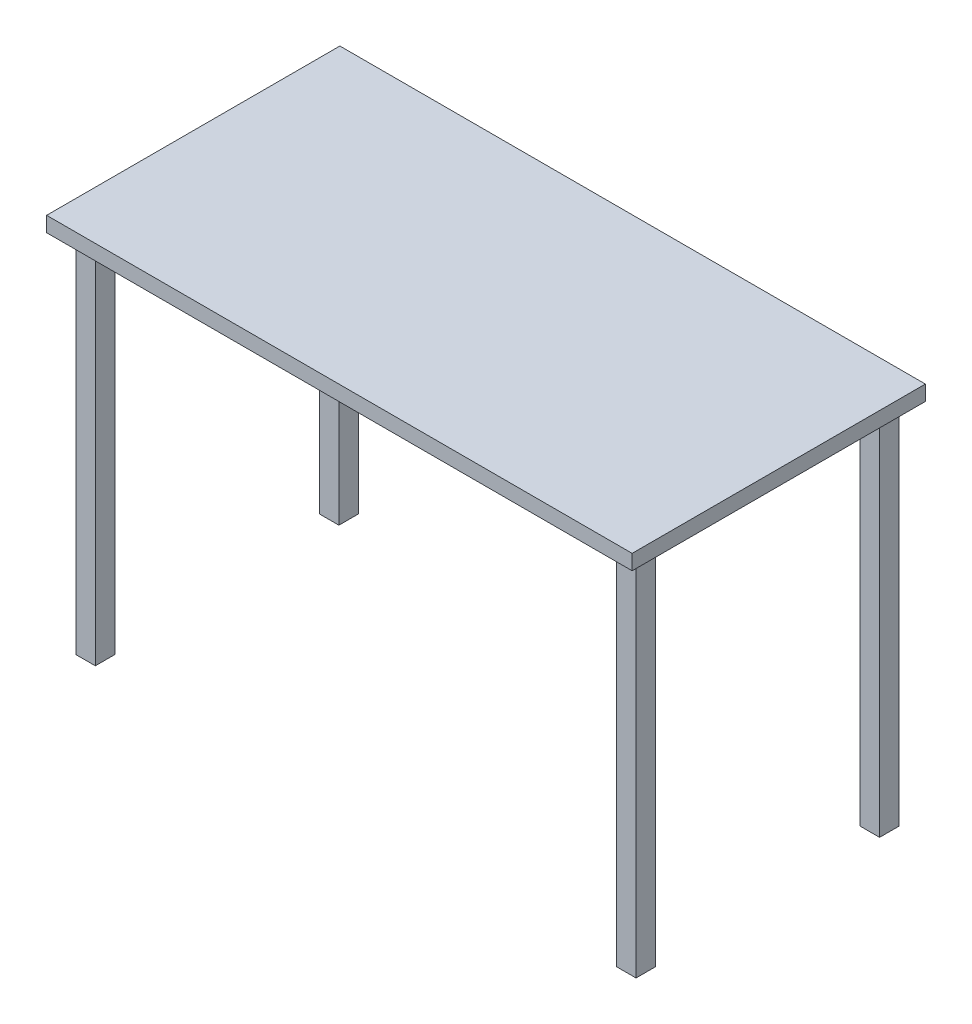
ISO-10303-21;
HEADER;
FILE_DESCRIPTION(('STEP AP214'),'2;1');
FILE_NAME('part.step','',(''),(''),'','','');
FILE_SCHEMA(('AUTOMOTIVE_DESIGN { 1 0 10303 214 1 1 1 1 }'));
ENDSEC;
DATA;
#1=APPLICATION_CONTEXT('core data for automotive mechanical design processes');
#2=APPLICATION_PROTOCOL_DEFINITION('international standard','automotive_design',2000,#1);
#3=PRODUCT_CONTEXT('',#1,'mechanical');
#4=PRODUCT('Part','Part','',(#3));
#5=PRODUCT_RELATED_PRODUCT_CATEGORY('part','',(#4));
#6=PRODUCT_DEFINITION_FORMATION('','',#4);
#7=PRODUCT_DEFINITION_CONTEXT('part definition',#1,'design');
#8=PRODUCT_DEFINITION('design','',#6,#7);
#9=PRODUCT_DEFINITION_SHAPE('','',#8);
#10=(LENGTH_UNIT() NAMED_UNIT(*) SI_UNIT(.MILLI.,.METRE.));
#11=(NAMED_UNIT(*) PLANE_ANGLE_UNIT() SI_UNIT($,.RADIAN.));
#12=(NAMED_UNIT(*) SI_UNIT($,.STERADIAN.) SOLID_ANGLE_UNIT());
#13=UNCERTAINTY_MEASURE_WITH_UNIT(LENGTH_MEASURE(1.E-05),#10,'distance_accuracy_value','');
#14=(GEOMETRIC_REPRESENTATION_CONTEXT(3) GLOBAL_UNCERTAINTY_ASSIGNED_CONTEXT((#13)) GLOBAL_UNIT_ASSIGNED_CONTEXT((#10,
#11,#12)) REPRESENTATION_CONTEXT('',''));
#15=CARTESIAN_POINT('',(0.,0.,0.));
#16=DIRECTION('',(0.,0.,1.));
#17=DIRECTION('',(1.,0.,0.));
#18=AXIS2_PLACEMENT_3D('',#15,#16,#17);
#19=CARTESIAN_POINT('',(0.,-31.,0.));
#20=DIRECTION('',(0.,-1.,0.));
#21=DIRECTION('',(1.,0.,0.));
#22=AXIS2_PLACEMENT_3D('',#19,#20,#21);
#23=PLANE('',#22);
#24=DIRECTION('',(0.,0.,1.));
#25=VECTOR('',#24,1.);
#26=CARTESIAN_POINT('',(601.,-31.,301.));
#27=LINE('',#26,#25);
#28=CARTESIAN_POINT('',(601.,-31.,-301.));
#29=VERTEX_POINT('',#28);
#30=CARTESIAN_POINT('',(601.,-31.,301.));
#31=VERTEX_POINT('',#30);
#32=EDGE_CURVE('E351',#29,#31,#27,.T.);
#33=ORIENTED_EDGE('',*,*,#32,.T.);
#34=DIRECTION('',(-1.,0.,0.));
#35=VECTOR('',#34,1.);
#36=CARTESIAN_POINT('',(-601.,-31.,301.));
#37=LINE('',#36,#35);
#38=CARTESIAN_POINT('',(-601.,-31.,301.));
#39=VERTEX_POINT('',#38);
#40=EDGE_CURVE('E355',#31,#39,#37,.T.);
#41=ORIENTED_EDGE('',*,*,#40,.T.);
#42=DIRECTION('',(0.,0.,-1.));
#43=VECTOR('',#42,1.);
#44=CARTESIAN_POINT('',(-601.,-31.,301.));
#45=LINE('',#44,#43);
#46=CARTESIAN_POINT('',(-601.,-31.,-301.));
#47=VERTEX_POINT('',#46);
#48=EDGE_CURVE('E359',#39,#47,#45,.T.);
#49=ORIENTED_EDGE('',*,*,#48,.T.);
#50=DIRECTION('',(1.,0.,0.));
#51=VECTOR('',#50,1.);
#52=CARTESIAN_POINT('',(-601.,-31.,-301.));
#53=LINE('',#52,#51);
#54=EDGE_CURVE('E362',#47,#29,#53,.T.);
#55=ORIENTED_EDGE('',*,*,#54,.T.);
#56=EDGE_LOOP('',(#33,#41,#49,#55));
#57=FACE_BOUND('',#56,.T.);
#58=DIRECTION('',(1.,0.,0.));
#59=VECTOR('',#58,1.);
#60=CARTESIAN_POINT('',(-571.,-31.,231.));
#61=LINE('',#60,#59);
#62=CARTESIAN_POINT('',(-571.,-31.,231.));
#63=VERTEX_POINT('',#62);
#64=CARTESIAN_POINT('',(-531.,-31.,231.));
#65=VERTEX_POINT('',#64);
#66=EDGE_CURVE('E328',#63,#65,#61,.T.);
#67=ORIENTED_EDGE('',*,*,#66,.F.);
#68=DIRECTION('',(0.,0.,-1.));
#69=VECTOR('',#68,1.);
#70=CARTESIAN_POINT('',(-571.,-31.,271.));
#71=LINE('',#70,#69);
#72=CARTESIAN_POINT('',(-571.,-31.,271.));
#73=VERTEX_POINT('',#72);
#74=EDGE_CURVE('E298',#73,#63,#71,.T.);
#75=ORIENTED_EDGE('',*,*,#74,.F.);
#76=DIRECTION('',(-1.,0.,0.));
#77=VECTOR('',#76,1.);
#78=CARTESIAN_POINT('',(-571.,-31.,271.));
#79=LINE('',#78,#77);
#80=CARTESIAN_POINT('',(-531.,-31.,271.));
#81=VERTEX_POINT('',#80);
#82=EDGE_CURVE('E315',#81,#73,#79,.T.);
#83=ORIENTED_EDGE('',*,*,#82,.F.);
#84=DIRECTION('',(0.,0.,1.));
#85=VECTOR('',#84,1.);
#86=CARTESIAN_POINT('',(-531.,-31.,271.));
#87=LINE('',#86,#85);
#88=EDGE_CURVE('E331',#65,#81,#87,.T.);
#89=ORIENTED_EDGE('',*,*,#88,.F.);
#90=EDGE_LOOP('',(#67,#75,#83,#89));
#91=FACE_BOUND('',#90,.T.);
#92=DIRECTION('',(0.,0.,-1.));
#93=VECTOR('',#92,1.);
#94=CARTESIAN_POINT('',(539.,-31.,271.));
#95=LINE('',#94,#93);
#96=CARTESIAN_POINT('',(539.,-31.,271.));
#97=VERTEX_POINT('',#96);
#98=CARTESIAN_POINT('',(539.,-31.,231.));
#99=VERTEX_POINT('',#98);
#100=EDGE_CURVE('E291',#97,#99,#95,.T.);
#101=ORIENTED_EDGE('',*,*,#100,.F.);
#102=DIRECTION('',(-1.,0.,0.));
#103=VECTOR('',#102,1.);
#104=CARTESIAN_POINT('',(539.,-31.,271.));
#105=LINE('',#104,#103);
#106=CARTESIAN_POINT('',(579.,-31.,271.));
#107=VERTEX_POINT('',#106);
#108=EDGE_CURVE('E294',#107,#97,#105,.T.);
#109=ORIENTED_EDGE('',*,*,#108,.F.);
#110=DIRECTION('',(0.,0.,1.));
#111=VECTOR('',#110,1.);
#112=CARTESIAN_POINT('',(579.,-31.,271.));
#113=LINE('',#112,#111);
#114=CARTESIAN_POINT('',(579.,-31.,231.));
#115=VERTEX_POINT('',#114);
#116=EDGE_CURVE('E283',#115,#107,#113,.T.);
#117=ORIENTED_EDGE('',*,*,#116,.F.);
#118=DIRECTION('',(1.,0.,0.));
#119=VECTOR('',#118,1.);
#120=CARTESIAN_POINT('',(539.,-31.,231.));
#121=LINE('',#120,#119);
#122=EDGE_CURVE('E286',#99,#115,#121,.T.);
#123=ORIENTED_EDGE('',*,*,#122,.F.);
#124=EDGE_LOOP('',(#101,#109,#117,#123));
#125=FACE_BOUND('',#124,.T.);
#126=DIRECTION('',(0.,0.,-1.));
#127=VECTOR('',#126,1.);
#128=CARTESIAN_POINT('',(539.000000000005,-31.,-229.));
#129=LINE('',#128,#127);
#130=CARTESIAN_POINT('',(539.000000000005,-31.,-229.));
#131=VERTEX_POINT('',#130);
#132=CARTESIAN_POINT('',(539.000000000005,-31.,-269.));
#133=VERTEX_POINT('',#132);
#134=EDGE_CURVE('E250',#131,#133,#129,.T.);
#135=ORIENTED_EDGE('',*,*,#134,.F.);
#136=DIRECTION('',(-1.,0.,0.));
#137=VECTOR('',#136,1.);
#138=CARTESIAN_POINT('',(539.000000000005,-31.,-229.));
#139=LINE('',#138,#137);
#140=CARTESIAN_POINT('',(579.000000000005,-31.,-229.));
#141=VERTEX_POINT('',#140);
#142=EDGE_CURVE('E253',#141,#131,#139,.T.);
#143=ORIENTED_EDGE('',*,*,#142,.F.);
#144=DIRECTION('',(0.,0.,1.));
#145=VECTOR('',#144,1.);
#146=CARTESIAN_POINT('',(579.000000000005,-31.,-229.));
#147=LINE('',#146,#145);
#148=CARTESIAN_POINT('',(579.000000000005,-31.,-269.));
#149=VERTEX_POINT('',#148);
#150=EDGE_CURVE('E243',#149,#141,#147,.T.);
#151=ORIENTED_EDGE('',*,*,#150,.F.);
#152=DIRECTION('',(1.,0.,0.));
#153=VECTOR('',#152,1.);
#154=CARTESIAN_POINT('',(539.000000000005,-31.,-269.));
#155=LINE('',#154,#153);
#156=EDGE_CURVE('E246',#133,#149,#155,.T.);
#157=ORIENTED_EDGE('',*,*,#156,.F.);
#158=EDGE_LOOP('',(#135,#143,#151,#157));
#159=FACE_BOUND('',#158,.T.);
#160=DIRECTION('',(0.,0.,-1.));
#161=VECTOR('',#160,1.);
#162=CARTESIAN_POINT('',(-570.999999999995,-31.,-229.));
#163=LINE('',#162,#161);
#164=CARTESIAN_POINT('',(-570.999999999995,-31.,-229.));
#165=VERTEX_POINT('',#164);
#166=CARTESIAN_POINT('',(-570.999999999995,-31.,-269.));
#167=VERTEX_POINT('',#166);
#168=EDGE_CURVE('E212',#165,#167,#163,.T.);
#169=ORIENTED_EDGE('',*,*,#168,.F.);
#170=DIRECTION('',(-1.,0.,0.));
#171=VECTOR('',#170,1.);
#172=CARTESIAN_POINT('',(-570.999999999995,-31.,-229.));
#173=LINE('',#172,#171);
#174=CARTESIAN_POINT('',(-530.999999999995,-31.,-229.));
#175=VERTEX_POINT('',#174);
#176=EDGE_CURVE('E206',#175,#165,#173,.T.);
#177=ORIENTED_EDGE('',*,*,#176,.F.);
#178=DIRECTION('',(0.,0.,1.));
#179=VECTOR('',#178,1.);
#180=CARTESIAN_POINT('',(-530.999999999995,-31.,-229.));
#181=LINE('',#180,#179);
#182=CARTESIAN_POINT('',(-530.999999999995,-31.,-269.));
#183=VERTEX_POINT('',#182);
#184=EDGE_CURVE('E190',#183,#175,#181,.T.);
#185=ORIENTED_EDGE('',*,*,#184,.F.);
#186=DIRECTION('',(1.,0.,0.));
#187=VECTOR('',#186,1.);
#188=CARTESIAN_POINT('',(-570.999999999995,-31.,-269.));
#189=LINE('',#188,#187);
#190=EDGE_CURVE('E199',#167,#183,#189,.T.);
#191=ORIENTED_EDGE('',*,*,#190,.F.);
#192=EDGE_LOOP('',(#169,#177,#185,#191));
#193=FACE_BOUND('',#192,.T.);
#194=ADVANCED_FACE('F51',(#57,#91,#125,#159,#193),#23,.T.);
#195=CARTESIAN_POINT('',(601.,-31.,301.));
#196=DIRECTION('',(-1.,0.,0.));
#197=DIRECTION('',(0.,0.,1.));
#198=AXIS2_PLACEMENT_3D('',#195,#196,#197);
#199=PLANE('',#198);
#200=DIRECTION('',(0.,0.,1.));
#201=VECTOR('',#200,1.);
#202=CARTESIAN_POINT('',(601.,0.,301.));
#203=LINE('',#202,#201);
#204=CARTESIAN_POINT('',(601.,0.,-301.));
#205=VERTEX_POINT('',#204);
#206=CARTESIAN_POINT('',(601.,0.,301.));
#207=VERTEX_POINT('',#206);
#208=EDGE_CURVE('E350',#205,#207,#203,.T.);
#209=ORIENTED_EDGE('',*,*,#208,.T.);
#210=DIRECTION('',(0.,1.,0.));
#211=VECTOR('',#210,1.);
#212=CARTESIAN_POINT('',(601.,-31.,301.));
#213=LINE('',#212,#211);
#214=EDGE_CURVE('E11',#31,#207,#213,.T.);
#215=ORIENTED_EDGE('',*,*,#214,.F.);
#216=ORIENTED_EDGE('',*,*,#32,.F.);
#217=DIRECTION('',(0.,1.,0.));
#218=VECTOR('',#217,1.);
#219=CARTESIAN_POINT('',(601.,-31.,-301.));
#220=LINE('',#219,#218);
#221=EDGE_CURVE('E365',#29,#205,#220,.T.);
#222=ORIENTED_EDGE('',*,*,#221,.T.);
#223=EDGE_LOOP('',(#209,#215,#216,#222));
#224=FACE_BOUND('',#223,.T.);
#225=ADVANCED_FACE('F53',(#224),#199,.F.);
#226=CARTESIAN_POINT('',(-601.,-31.,301.));
#227=DIRECTION('',(0.,0.,-1.));
#228=DIRECTION('',(-1.,0.,0.));
#229=AXIS2_PLACEMENT_3D('',#226,#227,#228);
#230=PLANE('',#229);
#231=DIRECTION('',(-1.,0.,0.));
#232=VECTOR('',#231,1.);
#233=CARTESIAN_POINT('',(-601.,0.,301.));
#234=LINE('',#233,#232);
#235=CARTESIAN_POINT('',(-601.,0.,301.));
#236=VERTEX_POINT('',#235);
#237=EDGE_CURVE('E369',#207,#236,#234,.T.);
#238=ORIENTED_EDGE('',*,*,#237,.T.);
#239=DIRECTION('',(0.,1.,0.));
#240=VECTOR('',#239,1.);
#241=CARTESIAN_POINT('',(-601.,-31.,301.));
#242=LINE('',#241,#240);
#243=EDGE_CURVE('E60',#39,#236,#242,.T.);
#244=ORIENTED_EDGE('',*,*,#243,.F.);
#245=ORIENTED_EDGE('',*,*,#40,.F.);
#246=ORIENTED_EDGE('',*,*,#214,.T.);
#247=EDGE_LOOP('',(#238,#244,#245,#246));
#248=FACE_BOUND('',#247,.T.);
#249=ADVANCED_FACE('F405',(#248),#230,.F.);
#250=CARTESIAN_POINT('',(-601.,-31.,301.));
#251=DIRECTION('',(1.,0.,0.));
#252=DIRECTION('',(0.,1.,0.));
#253=AXIS2_PLACEMENT_3D('',#250,#251,#252);
#254=PLANE('',#253);
#255=DIRECTION('',(0.,0.,-1.));
#256=VECTOR('',#255,1.);
#257=CARTESIAN_POINT('',(-601.,0.,301.));
#258=LINE('',#257,#256);
#259=CARTESIAN_POINT('',(-601.,0.,-301.));
#260=VERTEX_POINT('',#259);
#261=EDGE_CURVE('E372',#236,#260,#258,.T.);
#262=ORIENTED_EDGE('',*,*,#261,.T.);
#263=DIRECTION('',(0.,1.,0.));
#264=VECTOR('',#263,1.);
#265=CARTESIAN_POINT('',(-601.,-31.,-301.));
#266=LINE('',#265,#264);
#267=EDGE_CURVE('E380',#47,#260,#266,.T.);
#268=ORIENTED_EDGE('',*,*,#267,.F.);
#269=ORIENTED_EDGE('',*,*,#48,.F.);
#270=ORIENTED_EDGE('',*,*,#243,.T.);
#271=EDGE_LOOP('',(#262,#268,#269,#270));
#272=FACE_BOUND('',#271,.T.);
#273=ADVANCED_FACE('F389',(#272),#254,.F.);
#274=CARTESIAN_POINT('',(-601.,-31.,-301.));
#275=DIRECTION('',(0.,0.,1.));
#276=DIRECTION('',(1.,0.,0.));
#277=AXIS2_PLACEMENT_3D('',#274,#275,#276);
#278=PLANE('',#277);
#279=DIRECTION('',(1.,0.,0.));
#280=VECTOR('',#279,1.);
#281=CARTESIAN_POINT('',(-601.,0.,-301.));
#282=LINE('',#281,#280);
#283=EDGE_CURVE('E356',#260,#205,#282,.T.);
#284=ORIENTED_EDGE('',*,*,#283,.T.);
#285=ORIENTED_EDGE('',*,*,#221,.F.);
#286=ORIENTED_EDGE('',*,*,#54,.F.);
#287=ORIENTED_EDGE('',*,*,#267,.T.);
#288=EDGE_LOOP('',(#284,#285,#286,#287));
#289=FACE_BOUND('',#288,.T.);
#290=ADVANCED_FACE('F398',(#289),#278,.F.);
#291=CARTESIAN_POINT('',(0.,0.,0.));
#292=DIRECTION('',(0.,-1.,0.));
#293=DIRECTION('',(1.,0.,0.));
#294=AXIS2_PLACEMENT_3D('',#291,#292,#293);
#295=PLANE('',#294);
#296=ORIENTED_EDGE('',*,*,#261,.F.);
#297=ORIENTED_EDGE('',*,*,#237,.F.);
#298=ORIENTED_EDGE('',*,*,#208,.F.);
#299=ORIENTED_EDGE('',*,*,#283,.F.);
#300=EDGE_LOOP('',(#296,#297,#298,#299));
#301=FACE_BOUND('',#300,.T.);
#302=ADVANCED_FACE('F394',(#301),#295,.F.);
#303=CARTESIAN_POINT('',(-571.,-781.,271.));
#304=DIRECTION('',(1.,0.,0.));
#305=DIRECTION('',(0.,1.,0.));
#306=AXIS2_PLACEMENT_3D('',#303,#304,#305);
#307=PLANE('',#306);
#308=ORIENTED_EDGE('',*,*,#74,.T.);
#309=DIRECTION('',(0.,1.,0.));
#310=VECTOR('',#309,1.);
#311=CARTESIAN_POINT('',(-571.,-781.,231.));
#312=LINE('',#311,#310);
#313=CARTESIAN_POINT('',(-571.,-781.,231.));
#314=VERTEX_POINT('',#313);
#315=EDGE_CURVE('E347',#314,#63,#312,.T.);
#316=ORIENTED_EDGE('',*,*,#315,.F.);
#317=DIRECTION('',(0.,0.,-1.));
#318=VECTOR('',#317,1.);
#319=CARTESIAN_POINT('',(-571.,-781.,271.));
#320=LINE('',#319,#318);
#321=CARTESIAN_POINT('',(-571.,-781.,271.));
#322=VERTEX_POINT('',#321);
#323=EDGE_CURVE('E310',#322,#314,#320,.T.);
#324=ORIENTED_EDGE('',*,*,#323,.F.);
#325=DIRECTION('',(0.,1.,0.));
#326=VECTOR('',#325,1.);
#327=CARTESIAN_POINT('',(-571.,-781.,271.));
#328=LINE('',#327,#326);
#329=EDGE_CURVE('E324',#322,#73,#328,.T.);
#330=ORIENTED_EDGE('',*,*,#329,.T.);
#331=EDGE_LOOP('',(#308,#316,#324,#330));
#332=FACE_BOUND('',#331,.T.);
#333=ADVANCED_FACE('F421',(#332),#307,.F.);
#334=CARTESIAN_POINT('',(-571.,-781.,231.));
#335=DIRECTION('',(0.,0.,1.));
#336=DIRECTION('',(1.,0.,0.));
#337=AXIS2_PLACEMENT_3D('',#334,#335,#336);
#338=PLANE('',#337);
#339=ORIENTED_EDGE('',*,*,#66,.T.);
#340=DIRECTION('',(0.,1.,0.));
#341=VECTOR('',#340,1.);
#342=CARTESIAN_POINT('',(-531.,-781.,231.));
#343=LINE('',#342,#341);
#344=CARTESIAN_POINT('',(-531.,-781.,231.));
#345=VERTEX_POINT('',#344);
#346=EDGE_CURVE('E343',#345,#65,#343,.T.);
#347=ORIENTED_EDGE('',*,*,#346,.F.);
#348=DIRECTION('',(1.,0.,0.));
#349=VECTOR('',#348,1.);
#350=CARTESIAN_POINT('',(-571.,-781.,231.));
#351=LINE('',#350,#349);
#352=EDGE_CURVE('E314',#314,#345,#351,.T.);
#353=ORIENTED_EDGE('',*,*,#352,.F.);
#354=ORIENTED_EDGE('',*,*,#315,.T.);
#355=EDGE_LOOP('',(#339,#347,#353,#354));
#356=FACE_BOUND('',#355,.T.);
#357=ADVANCED_FACE('F616',(#356),#338,.F.);
#358=CARTESIAN_POINT('',(-531.,-781.,271.));
#359=DIRECTION('',(-1.,0.,0.));
#360=DIRECTION('',(0.,-1.,0.));
#361=AXIS2_PLACEMENT_3D('',#358,#359,#360);
#362=PLANE('',#361);
#363=ORIENTED_EDGE('',*,*,#88,.T.);
#364=DIRECTION('',(0.,1.,0.));
#365=VECTOR('',#364,1.);
#366=CARTESIAN_POINT('',(-531.,-781.,271.));
#367=LINE('',#366,#365);
#368=CARTESIAN_POINT('',(-531.,-781.,271.));
#369=VERTEX_POINT('',#368);
#370=EDGE_CURVE('E340',#369,#81,#367,.T.);
#371=ORIENTED_EDGE('',*,*,#370,.F.);
#372=DIRECTION('',(0.,0.,1.));
#373=VECTOR('',#372,1.);
#374=CARTESIAN_POINT('',(-531.,-781.,271.));
#375=LINE('',#374,#373);
#376=EDGE_CURVE('E318',#345,#369,#375,.T.);
#377=ORIENTED_EDGE('',*,*,#376,.F.);
#378=ORIENTED_EDGE('',*,*,#346,.T.);
#379=EDGE_LOOP('',(#363,#371,#377,#378));
#380=FACE_BOUND('',#379,.T.);
#381=ADVANCED_FACE('F606',(#380),#362,.F.);
#382=CARTESIAN_POINT('',(-571.,-781.,271.));
#383=DIRECTION('',(0.,0.,-1.));
#384=DIRECTION('',(0.,1.,0.));
#385=AXIS2_PLACEMENT_3D('',#382,#383,#384);
#386=PLANE('',#385);
#387=ORIENTED_EDGE('',*,*,#82,.T.);
#388=ORIENTED_EDGE('',*,*,#329,.F.);
#389=DIRECTION('',(-1.,0.,0.));
#390=VECTOR('',#389,1.);
#391=CARTESIAN_POINT('',(-571.,-781.,271.));
#392=LINE('',#391,#390);
#393=EDGE_CURVE('E321',#369,#322,#392,.T.);
#394=ORIENTED_EDGE('',*,*,#393,.F.);
#395=ORIENTED_EDGE('',*,*,#370,.T.);
#396=EDGE_LOOP('',(#387,#388,#394,#395));
#397=FACE_BOUND('',#396,.T.);
#398=ADVANCED_FACE('F596',(#397),#386,.F.);
#399=CARTESIAN_POINT('',(0.,-781.,0.));
#400=DIRECTION('',(0.,-1.,0.));
#401=DIRECTION('',(0.,0.,-1.));
#402=AXIS2_PLACEMENT_3D('',#399,#400,#401);
#403=PLANE('',#402);
#404=ORIENTED_EDGE('',*,*,#323,.T.);
#405=ORIENTED_EDGE('',*,*,#352,.T.);
#406=ORIENTED_EDGE('',*,*,#376,.T.);
#407=ORIENTED_EDGE('',*,*,#393,.T.);
#408=EDGE_LOOP('',(#404,#405,#406,#407));
#409=FACE_BOUND('',#408,.T.);
#410=ADVANCED_FACE('F586',(#409),#403,.T.);
#411=CARTESIAN_POINT('',(539.,-781.,271.));
#412=DIRECTION('',(0.,0.,-1.));
#413=DIRECTION('',(0.,1.,0.));
#414=AXIS2_PLACEMENT_3D('',#411,#412,#413);
#415=PLANE('',#414);
#416=ORIENTED_EDGE('',*,*,#108,.T.);
#417=DIRECTION('',(0.,1.,0.));
#418=VECTOR('',#417,1.);
#419=CARTESIAN_POINT('',(539.,-781.,271.));
#420=LINE('',#419,#418);
#421=CARTESIAN_POINT('',(539.,-781.,271.));
#422=VERTEX_POINT('',#421);
#423=EDGE_CURVE('E257',#422,#97,#420,.T.);
#424=ORIENTED_EDGE('',*,*,#423,.F.);
#425=DIRECTION('',(-1.,0.,0.));
#426=VECTOR('',#425,1.);
#427=CARTESIAN_POINT('',(539.,-781.,271.));
#428=LINE('',#427,#426);
#429=CARTESIAN_POINT('',(579.,-781.,271.));
#430=VERTEX_POINT('',#429);
#431=EDGE_CURVE('E287',#430,#422,#428,.T.);
#432=ORIENTED_EDGE('',*,*,#431,.F.);
#433=DIRECTION('',(0.,1.,0.));
#434=VECTOR('',#433,1.);
#435=CARTESIAN_POINT('',(579.,-781.,271.));
#436=LINE('',#435,#434);
#437=EDGE_CURVE('E278',#430,#107,#436,.T.);
#438=ORIENTED_EDGE('',*,*,#437,.T.);
#439=EDGE_LOOP('',(#416,#424,#432,#438));
#440=FACE_BOUND('',#439,.T.);
#441=ADVANCED_FACE('F576',(#440),#415,.F.);
#442=CARTESIAN_POINT('',(539.,-781.,271.));
#443=DIRECTION('',(1.,0.,0.));
#444=DIRECTION('',(0.,1.,0.));
#445=AXIS2_PLACEMENT_3D('',#442,#443,#444);
#446=PLANE('',#445);
#447=ORIENTED_EDGE('',*,*,#100,.T.);
#448=DIRECTION('',(0.,1.,0.));
#449=VECTOR('',#448,1.);
#450=CARTESIAN_POINT('',(539.,-781.,231.));
#451=LINE('',#450,#449);
#452=CARTESIAN_POINT('',(539.,-781.,231.));
#453=VERTEX_POINT('',#452);
#454=EDGE_CURVE('E271',#453,#99,#451,.T.);
#455=ORIENTED_EDGE('',*,*,#454,.F.);
#456=DIRECTION('',(0.,0.,-1.));
#457=VECTOR('',#456,1.);
#458=CARTESIAN_POINT('',(539.,-781.,271.));
#459=LINE('',#458,#457);
#460=EDGE_CURVE('E304',#422,#453,#459,.T.);
#461=ORIENTED_EDGE('',*,*,#460,.F.);
#462=ORIENTED_EDGE('',*,*,#423,.T.);
#463=EDGE_LOOP('',(#447,#455,#461,#462));
#464=FACE_BOUND('',#463,.T.);
#465=ADVANCED_FACE('F566',(#464),#446,.F.);
#466=CARTESIAN_POINT('',(539.,-781.,231.));
#467=DIRECTION('',(0.,0.,1.));
#468=DIRECTION('',(1.,0.,0.));
#469=AXIS2_PLACEMENT_3D('',#466,#467,#468);
#470=PLANE('',#469);
#471=ORIENTED_EDGE('',*,*,#122,.T.);
#472=DIRECTION('',(0.,1.,0.));
#473=VECTOR('',#472,1.);
#474=CARTESIAN_POINT('',(579.,-781.,231.));
#475=LINE('',#474,#473);
#476=CARTESIAN_POINT('',(579.,-781.,231.));
#477=VERTEX_POINT('',#476);
#478=EDGE_CURVE('E275',#477,#115,#475,.T.);
#479=ORIENTED_EDGE('',*,*,#478,.F.);
#480=DIRECTION('',(1.,0.,0.));
#481=VECTOR('',#480,1.);
#482=CARTESIAN_POINT('',(539.,-781.,231.));
#483=LINE('',#482,#481);
#484=EDGE_CURVE('E301',#453,#477,#483,.T.);
#485=ORIENTED_EDGE('',*,*,#484,.F.);
#486=ORIENTED_EDGE('',*,*,#454,.T.);
#487=EDGE_LOOP('',(#471,#479,#485,#486));
#488=FACE_BOUND('',#487,.T.);
#489=ADVANCED_FACE('F556',(#488),#470,.F.);
#490=CARTESIAN_POINT('',(579.,-781.,271.));
#491=DIRECTION('',(-1.,0.,0.));
#492=DIRECTION('',(0.,-1.,0.));
#493=AXIS2_PLACEMENT_3D('',#490,#491,#492);
#494=PLANE('',#493);
#495=ORIENTED_EDGE('',*,*,#116,.T.);
#496=ORIENTED_EDGE('',*,*,#437,.F.);
#497=DIRECTION('',(0.,0.,1.));
#498=VECTOR('',#497,1.);
#499=CARTESIAN_POINT('',(579.,-781.,271.));
#500=LINE('',#499,#498);
#501=EDGE_CURVE('E282',#477,#430,#500,.T.);
#502=ORIENTED_EDGE('',*,*,#501,.F.);
#503=ORIENTED_EDGE('',*,*,#478,.T.);
#504=EDGE_LOOP('',(#495,#496,#502,#503));
#505=FACE_BOUND('',#504,.T.);
#506=ADVANCED_FACE('F546',(#505),#494,.F.);
#507=CARTESIAN_POINT('',(0.,-781.,0.));
#508=DIRECTION('',(0.,1.,0.));
#509=DIRECTION('',(0.,0.,1.));
#510=AXIS2_PLACEMENT_3D('',#507,#508,#509);
#511=PLANE('',#510);
#512=ORIENTED_EDGE('',*,*,#431,.T.);
#513=ORIENTED_EDGE('',*,*,#460,.T.);
#514=ORIENTED_EDGE('',*,*,#484,.T.);
#515=ORIENTED_EDGE('',*,*,#501,.T.);
#516=EDGE_LOOP('',(#512,#513,#514,#515));
#517=FACE_BOUND('',#516,.T.);
#518=ADVANCED_FACE('F536',(#517),#511,.F.);
#519=CARTESIAN_POINT('',(539.000000000005,-781.,-229.));
#520=DIRECTION('',(0.,0.,-1.));
#521=DIRECTION('',(0.,1.,0.));
#522=AXIS2_PLACEMENT_3D('',#519,#520,#521);
#523=PLANE('',#522);
#524=ORIENTED_EDGE('',*,*,#142,.T.);
#525=DIRECTION('',(0.,1.,0.));
#526=VECTOR('',#525,1.);
#527=CARTESIAN_POINT('',(539.000000000005,-781.,-229.));
#528=LINE('',#527,#526);
#529=CARTESIAN_POINT('',(539.000000000005,-781.,-229.));
#530=VERTEX_POINT('',#529);
#531=EDGE_CURVE('E214',#530,#131,#528,.T.);
#532=ORIENTED_EDGE('',*,*,#531,.F.);
#533=DIRECTION('',(-1.,0.,0.));
#534=VECTOR('',#533,1.);
#535=CARTESIAN_POINT('',(539.000000000005,-781.,-229.));
#536=LINE('',#535,#534);
#537=CARTESIAN_POINT('',(579.000000000005,-781.,-229.));
#538=VERTEX_POINT('',#537);
#539=EDGE_CURVE('E247',#538,#530,#536,.T.);
#540=ORIENTED_EDGE('',*,*,#539,.F.);
#541=DIRECTION('',(0.,1.,0.));
#542=VECTOR('',#541,1.);
#543=CARTESIAN_POINT('',(579.000000000005,-781.,-229.));
#544=LINE('',#543,#542);
#545=EDGE_CURVE('E238',#538,#141,#544,.T.);
#546=ORIENTED_EDGE('',*,*,#545,.T.);
#547=EDGE_LOOP('',(#524,#532,#540,#546));
#548=FACE_BOUND('',#547,.T.);
#549=ADVANCED_FACE('F526',(#548),#523,.F.);
#550=CARTESIAN_POINT('',(539.000000000005,-781.,-229.));
#551=DIRECTION('',(1.,0.,0.));
#552=DIRECTION('',(0.,1.,0.));
#553=AXIS2_PLACEMENT_3D('',#550,#551,#552);
#554=PLANE('',#553);
#555=ORIENTED_EDGE('',*,*,#134,.T.);
#556=DIRECTION('',(0.,1.,0.));
#557=VECTOR('',#556,1.);
#558=CARTESIAN_POINT('',(539.000000000005,-781.,-269.));
#559=LINE('',#558,#557);
#560=CARTESIAN_POINT('',(539.000000000005,-781.,-269.));
#561=VERTEX_POINT('',#560);
#562=EDGE_CURVE('E218',#561,#133,#559,.T.);
#563=ORIENTED_EDGE('',*,*,#562,.F.);
#564=DIRECTION('',(0.,0.,-1.));
#565=VECTOR('',#564,1.);
#566=CARTESIAN_POINT('',(539.000000000005,-781.,-229.));
#567=LINE('',#566,#565);
#568=EDGE_CURVE('E263',#530,#561,#567,.T.);
#569=ORIENTED_EDGE('',*,*,#568,.F.);
#570=ORIENTED_EDGE('',*,*,#531,.T.);
#571=EDGE_LOOP('',(#555,#563,#569,#570));
#572=FACE_BOUND('',#571,.T.);
#573=ADVANCED_FACE('F516',(#572),#554,.F.);
#574=CARTESIAN_POINT('',(539.000000000005,-781.,-269.));
#575=DIRECTION('',(0.,0.,1.));
#576=DIRECTION('',(1.,0.,0.));
#577=AXIS2_PLACEMENT_3D('',#574,#575,#576);
#578=PLANE('',#577);
#579=ORIENTED_EDGE('',*,*,#156,.T.);
#580=DIRECTION('',(0.,1.,0.));
#581=VECTOR('',#580,1.);
#582=CARTESIAN_POINT('',(579.000000000005,-781.,-269.));
#583=LINE('',#582,#581);
#584=CARTESIAN_POINT('',(579.000000000005,-781.,-269.));
#585=VERTEX_POINT('',#584);
#586=EDGE_CURVE('E75',#585,#149,#583,.T.);
#587=ORIENTED_EDGE('',*,*,#586,.F.);
#588=DIRECTION('',(1.,0.,0.));
#589=VECTOR('',#588,1.);
#590=CARTESIAN_POINT('',(539.000000000005,-781.,-269.));
#591=LINE('',#590,#589);
#592=EDGE_CURVE('E260',#561,#585,#591,.T.);
#593=ORIENTED_EDGE('',*,*,#592,.F.);
#594=ORIENTED_EDGE('',*,*,#562,.T.);
#595=EDGE_LOOP('',(#579,#587,#593,#594));
#596=FACE_BOUND('',#595,.T.);
#597=ADVANCED_FACE('F507',(#596),#578,.F.);
#598=CARTESIAN_POINT('',(579.000000000005,-781.,-229.));
#599=DIRECTION('',(-1.,0.,0.));
#600=DIRECTION('',(0.,-1.,0.));
#601=AXIS2_PLACEMENT_3D('',#598,#599,#600);
#602=PLANE('',#601);
#603=ORIENTED_EDGE('',*,*,#150,.T.);
#604=ORIENTED_EDGE('',*,*,#545,.F.);
#605=DIRECTION('',(0.,0.,1.));
#606=VECTOR('',#605,1.);
#607=CARTESIAN_POINT('',(579.000000000005,-781.,-229.));
#608=LINE('',#607,#606);
#609=EDGE_CURVE('E242',#585,#538,#608,.T.);
#610=ORIENTED_EDGE('',*,*,#609,.F.);
#611=ORIENTED_EDGE('',*,*,#586,.T.);
#612=EDGE_LOOP('',(#603,#604,#610,#611));
#613=FACE_BOUND('',#612,.T.);
#614=ADVANCED_FACE('F497',(#613),#602,.F.);
#615=CARTESIAN_POINT('',(0.,-781.,0.));
#616=DIRECTION('',(0.,1.,0.));
#617=DIRECTION('',(0.,0.,1.));
#618=AXIS2_PLACEMENT_3D('',#615,#616,#617);
#619=PLANE('',#618);
#620=ORIENTED_EDGE('',*,*,#539,.T.);
#621=ORIENTED_EDGE('',*,*,#568,.T.);
#622=ORIENTED_EDGE('',*,*,#592,.T.);
#623=ORIENTED_EDGE('',*,*,#609,.T.);
#624=EDGE_LOOP('',(#620,#621,#622,#623));
#625=FACE_BOUND('',#624,.T.);
#626=ADVANCED_FACE('F488',(#625),#619,.F.);
#627=CARTESIAN_POINT('',(-570.999999999995,-781.,-229.));
#628=DIRECTION('',(0.,0.,-1.));
#629=DIRECTION('',(0.,1.,0.));
#630=AXIS2_PLACEMENT_3D('',#627,#628,#629);
#631=PLANE('',#630);
#632=ORIENTED_EDGE('',*,*,#176,.T.);
#633=DIRECTION('',(0.,1.,0.));
#634=VECTOR('',#633,1.);
#635=CARTESIAN_POINT('',(-570.999999999995,-781.,-229.));
#636=LINE('',#635,#634);
#637=CARTESIAN_POINT('',(-570.999999999995,-781.,-229.));
#638=VERTEX_POINT('',#637);
#639=EDGE_CURVE('E693',#638,#165,#636,.T.);
#640=ORIENTED_EDGE('',*,*,#639,.F.);
#641=DIRECTION('',(-1.,0.,0.));
#642=VECTOR('',#641,1.);
#643=CARTESIAN_POINT('',(-570.999999999995,-781.,-229.));
#644=LINE('',#643,#642);
#645=CARTESIAN_POINT('',(-530.999999999995,-781.,-229.));
#646=VERTEX_POINT('',#645);
#647=EDGE_CURVE('E200',#646,#638,#644,.T.);
#648=ORIENTED_EDGE('',*,*,#647,.F.);
#649=DIRECTION('',(0.,1.,0.));
#650=VECTOR('',#649,1.);
#651=CARTESIAN_POINT('',(-530.999999999995,-781.,-229.));
#652=LINE('',#651,#650);
#653=EDGE_CURVE('E193',#646,#175,#652,.T.);
#654=ORIENTED_EDGE('',*,*,#653,.T.);
#655=EDGE_LOOP('',(#632,#640,#648,#654));
#656=FACE_BOUND('',#655,.T.);
#657=ADVANCED_FACE('F204',(#656),#631,.F.);
#658=CARTESIAN_POINT('',(-570.999999999995,-781.,-229.));
#659=DIRECTION('',(1.,0.,0.));
#660=DIRECTION('',(0.,1.,0.));
#661=AXIS2_PLACEMENT_3D('',#658,#659,#660);
#662=PLANE('',#661);
#663=ORIENTED_EDGE('',*,*,#168,.T.);
#664=DIRECTION('',(0.,1.,0.));
#665=VECTOR('',#664,1.);
#666=CARTESIAN_POINT('',(-570.999999999995,-781.,-269.));
#667=LINE('',#666,#665);
#668=CARTESIAN_POINT('',(-570.999999999995,-781.,-269.));
#669=VERTEX_POINT('',#668);
#670=EDGE_CURVE('E691',#669,#167,#667,.T.);
#671=ORIENTED_EDGE('',*,*,#670,.F.);
#672=DIRECTION('',(0.,0.,-1.));
#673=VECTOR('',#672,1.);
#674=CARTESIAN_POINT('',(-570.999999999995,-781.,-229.));
#675=LINE('',#674,#673);
#676=EDGE_CURVE('E228',#638,#669,#675,.T.);
#677=ORIENTED_EDGE('',*,*,#676,.F.);
#678=ORIENTED_EDGE('',*,*,#639,.T.);
#679=EDGE_LOOP('',(#663,#671,#677,#678));
#680=FACE_BOUND('',#679,.T.);
#681=ADVANCED_FACE('F469',(#680),#662,.F.);
#682=CARTESIAN_POINT('',(-570.999999999995,-781.,-269.));
#683=DIRECTION('',(0.,0.,1.));
#684=DIRECTION('',(1.,0.,0.));
#685=AXIS2_PLACEMENT_3D('',#682,#683,#684);
#686=PLANE('',#685);
#687=ORIENTED_EDGE('',*,*,#190,.T.);
#688=DIRECTION('',(0.,1.,0.));
#689=VECTOR('',#688,1.);
#690=CARTESIAN_POINT('',(-530.999999999995,-781.,-269.));
#691=LINE('',#690,#689);
#692=CARTESIAN_POINT('',(-530.999999999995,-781.,-269.));
#693=VERTEX_POINT('',#692);
#694=EDGE_CURVE('E67',#693,#183,#691,.T.);
#695=ORIENTED_EDGE('',*,*,#694,.F.);
#696=DIRECTION('',(1.,0.,0.));
#697=VECTOR('',#696,1.);
#698=CARTESIAN_POINT('',(-570.999999999995,-781.,-269.));
#699=LINE('',#698,#697);
#700=EDGE_CURVE('E225',#669,#693,#699,.T.);
#701=ORIENTED_EDGE('',*,*,#700,.F.);
#702=ORIENTED_EDGE('',*,*,#670,.T.);
#703=EDGE_LOOP('',(#687,#695,#701,#702));
#704=FACE_BOUND('',#703,.T.);
#705=ADVANCED_FACE('F460',(#704),#686,.F.);
#706=CARTESIAN_POINT('',(-530.999999999995,-781.,-229.));
#707=DIRECTION('',(-1.,0.,0.));
#708=DIRECTION('',(0.,-1.,0.));
#709=AXIS2_PLACEMENT_3D('',#706,#707,#708);
#710=PLANE('',#709);
#711=ORIENTED_EDGE('',*,*,#184,.T.);
#712=ORIENTED_EDGE('',*,*,#653,.F.);
#713=DIRECTION('',(0.,0.,1.));
#714=VECTOR('',#713,1.);
#715=CARTESIAN_POINT('',(-530.999999999995,-781.,-229.));
#716=LINE('',#715,#714);
#717=EDGE_CURVE('E210',#693,#646,#716,.T.);
#718=ORIENTED_EDGE('',*,*,#717,.F.);
#719=ORIENTED_EDGE('',*,*,#694,.T.);
#720=EDGE_LOOP('',(#711,#712,#718,#719));
#721=FACE_BOUND('',#720,.T.);
#722=ADVANCED_FACE('F192',(#721),#710,.F.);
#723=CARTESIAN_POINT('',(0.,-781.,0.));
#724=DIRECTION('',(0.,1.,0.));
#725=DIRECTION('',(0.,0.,1.));
#726=AXIS2_PLACEMENT_3D('',#723,#724,#725);
#727=PLANE('',#726);
#728=ORIENTED_EDGE('',*,*,#647,.T.);
#729=ORIENTED_EDGE('',*,*,#676,.T.);
#730=ORIENTED_EDGE('',*,*,#700,.T.);
#731=ORIENTED_EDGE('',*,*,#717,.T.);
#732=EDGE_LOOP('',(#728,#729,#730,#731));
#733=FACE_BOUND('',#732,.T.);
#734=ADVANCED_FACE('F446',(#733),#727,.F.);
#735=CLOSED_SHELL('',(#194,#225,#249,#273,#290,#302,#333,#357,#381,#398,#410,#441,#465,#489,
#506,#518,#549,#573,#597,#614,#626,#657,#681,#705,#722,#734));
#736=MANIFOLD_SOLID_BREP('B2',#735);
#737=ADVANCED_BREP_SHAPE_REPRESENTATION('',(#18,#736),#14);
#738=SHAPE_DEFINITION_REPRESENTATION(#9,#737);
ENDSEC;
END-ISO-10303-21;
